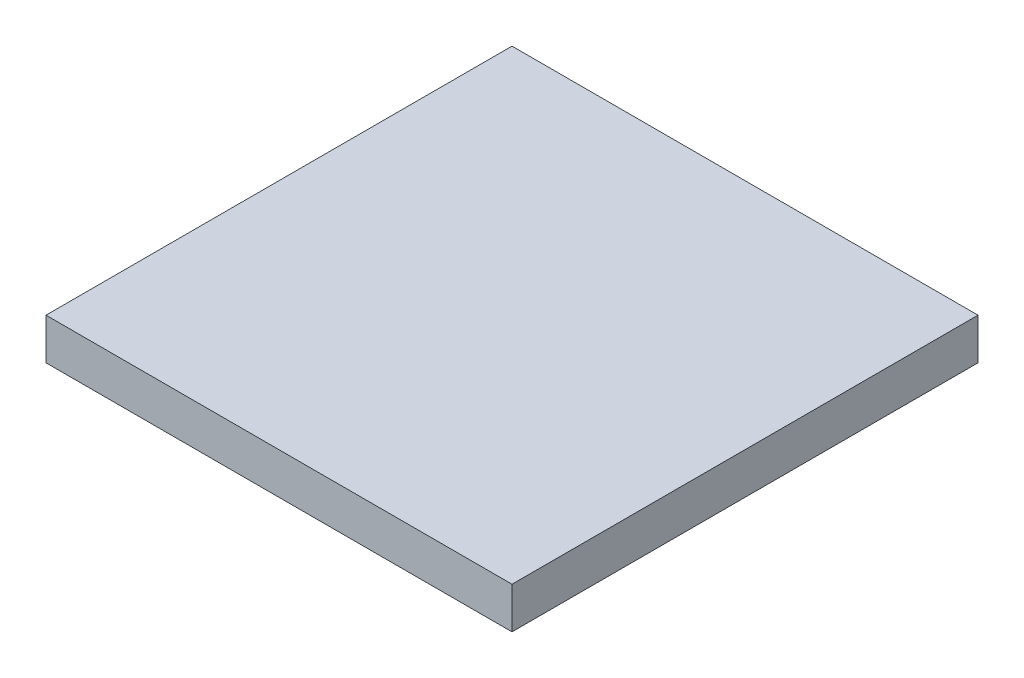
ISO-10303-21;
HEADER;
FILE_DESCRIPTION(('STEP AP214'),'2;1');
FILE_NAME('part.step','',(''),(''),'','','');
FILE_SCHEMA(('AUTOMOTIVE_DESIGN { 1 0 10303 214 1 1 1 1 }'));
ENDSEC;
DATA;
#1=APPLICATION_CONTEXT('core data for automotive mechanical design processes');
#2=APPLICATION_PROTOCOL_DEFINITION('international standard','automotive_design',2000,#1);
#3=PRODUCT_CONTEXT('',#1,'mechanical');
#4=PRODUCT('Part','Part','',(#3));
#5=PRODUCT_RELATED_PRODUCT_CATEGORY('part','',(#4));
#6=PRODUCT_DEFINITION_FORMATION('','',#4);
#7=PRODUCT_DEFINITION_CONTEXT('part definition',#1,'design');
#8=PRODUCT_DEFINITION('design','',#6,#7);
#9=PRODUCT_DEFINITION_SHAPE('','',#8);
#10=(LENGTH_UNIT() NAMED_UNIT(*) SI_UNIT(.MILLI.,.METRE.));
#11=(NAMED_UNIT(*) PLANE_ANGLE_UNIT() SI_UNIT($,.RADIAN.));
#12=(NAMED_UNIT(*) SI_UNIT($,.STERADIAN.) SOLID_ANGLE_UNIT());
#13=UNCERTAINTY_MEASURE_WITH_UNIT(LENGTH_MEASURE(1.E-05),#10,'distance_accuracy_value','');
#14=(GEOMETRIC_REPRESENTATION_CONTEXT(3) GLOBAL_UNCERTAINTY_ASSIGNED_CONTEXT((#13)) GLOBAL_UNIT_ASSIGNED_CONTEXT((#10,
#11,#12)) REPRESENTATION_CONTEXT('',''));
#15=CARTESIAN_POINT('',(0.,0.,0.));
#16=DIRECTION('',(0.,0.,1.));
#17=DIRECTION('',(1.,0.,0.));
#18=AXIS2_PLACEMENT_3D('',#15,#16,#17);
#19=CARTESIAN_POINT('',(-3.3274,2.9756,4.953));
#20=DIRECTION('',(1.,0.,0.));
#21=DIRECTION('',(0.,-1.,0.));
#22=AXIS2_PLACEMENT_3D('',#19,#20,#21);
#23=PLANE('',#22);
#24=DIRECTION('',(0.,0.,1.));
#25=VECTOR('',#24,1.);
#26=CARTESIAN_POINT('',(-3.3274,2.9306,4.953));
#27=LINE('',#26,#25);
#28=CARTESIAN_POINT('',(-3.3274,2.9306,4.4449999999999));
#29=VERTEX_POINT('',#28);
#30=CARTESIAN_POINT('',(-3.3274,2.9306,4.953));
#31=VERTEX_POINT('',#30);
#32=EDGE_CURVE('E11',#29,#31,#27,.T.);
#33=ORIENTED_EDGE('',*,*,#32,.T.);
#34=DIRECTION('',(0.,-1.,0.));
#35=VECTOR('',#34,1.);
#36=CARTESIAN_POINT('',(-3.3274,2.9756,4.953));
#37=LINE('',#36,#35);
#38=CARTESIAN_POINT('',(-3.3274,2.9756,4.953));
#39=VERTEX_POINT('',#38);
#40=EDGE_CURVE('E24',#39,#31,#37,.T.);
#41=ORIENTED_EDGE('',*,*,#40,.F.);
#42=DIRECTION('',(0.,0.,1.));
#43=VECTOR('',#42,1.);
#44=CARTESIAN_POINT('',(-3.3274,2.9756,4.953));
#45=LINE('',#44,#43);
#46=CARTESIAN_POINT('',(-3.3274,2.9756,4.4449999999999));
#47=VERTEX_POINT('',#46);
#48=EDGE_CURVE('E88',#47,#39,#45,.T.);
#49=ORIENTED_EDGE('',*,*,#48,.F.);
#50=DIRECTION('',(0.,-1.,0.));
#51=VECTOR('',#50,1.);
#52=CARTESIAN_POINT('',(-3.3274,2.9756,4.4449999999999));
#53=LINE('',#52,#51);
#54=EDGE_CURVE('E77',#47,#29,#53,.T.);
#55=ORIENTED_EDGE('',*,*,#54,.T.);
#56=EDGE_LOOP('',(#33,#41,#49,#55));
#57=FACE_BOUND('',#56,.T.);
#58=ADVANCED_FACE('F17',(#57),#23,.F.);
#59=CARTESIAN_POINT('',(-2.8194,2.9756,4.953));
#60=DIRECTION('',(0.,0.,-1.));
#61=DIRECTION('',(0.,1.,0.));
#62=AXIS2_PLACEMENT_3D('',#59,#60,#61);
#63=PLANE('',#62);
#64=DIRECTION('',(1.,0.,0.));
#65=VECTOR('',#64,1.);
#66=CARTESIAN_POINT('',(-2.8194,2.9306,4.953));
#67=LINE('',#66,#65);
#68=CARTESIAN_POINT('',(-2.8194,2.9306,4.953));
#69=VERTEX_POINT('',#68);
#70=EDGE_CURVE('E85',#31,#69,#67,.T.);
#71=ORIENTED_EDGE('',*,*,#70,.T.);
#72=DIRECTION('',(0.,-1.,0.));
#73=VECTOR('',#72,1.);
#74=CARTESIAN_POINT('',(-2.8194,2.9756,4.953));
#75=LINE('',#74,#73);
#76=CARTESIAN_POINT('',(-2.8194,2.9756,4.953));
#77=VERTEX_POINT('',#76);
#78=EDGE_CURVE('E83',#77,#69,#75,.T.);
#79=ORIENTED_EDGE('',*,*,#78,.F.);
#80=DIRECTION('',(1.,0.,0.));
#81=VECTOR('',#80,1.);
#82=CARTESIAN_POINT('',(-2.8194,2.9756,4.953));
#83=LINE('',#82,#81);
#84=EDGE_CURVE('E72',#39,#77,#83,.T.);
#85=ORIENTED_EDGE('',*,*,#84,.F.);
#86=ORIENTED_EDGE('',*,*,#40,.T.);
#87=EDGE_LOOP('',(#71,#79,#85,#86));
#88=FACE_BOUND('',#87,.T.);
#89=ADVANCED_FACE('F90',(#88),#63,.F.);
#90=CARTESIAN_POINT('',(-2.8194,2.9756,4.4449999999999));
#91=DIRECTION('',(-1.,0.,0.));
#92=DIRECTION('',(0.,1.,0.));
#93=AXIS2_PLACEMENT_3D('',#90,#91,#92);
#94=PLANE('',#93);
#95=DIRECTION('',(0.,0.,-1.));
#96=VECTOR('',#95,1.);
#97=CARTESIAN_POINT('',(-2.8194,2.9306,4.4449999999999));
#98=LINE('',#97,#96);
#99=CARTESIAN_POINT('',(-2.8194,2.9306,4.4449999999999));
#100=VERTEX_POINT('',#99);
#101=EDGE_CURVE('E60',#69,#100,#98,.T.);
#102=ORIENTED_EDGE('',*,*,#101,.T.);
#103=DIRECTION('',(0.,-1.,0.));
#104=VECTOR('',#103,1.);
#105=CARTESIAN_POINT('',(-2.8194,2.9756,4.4449999999999));
#106=LINE('',#105,#104);
#107=CARTESIAN_POINT('',(-2.8194,2.9756,4.4449999999999));
#108=VERTEX_POINT('',#107);
#109=EDGE_CURVE('E54',#108,#100,#106,.T.);
#110=ORIENTED_EDGE('',*,*,#109,.F.);
#111=DIRECTION('',(0.,0.,-1.));
#112=VECTOR('',#111,1.);
#113=CARTESIAN_POINT('',(-2.8194,2.9756,4.4449999999999));
#114=LINE('',#113,#112);
#115=EDGE_CURVE('E58',#77,#108,#114,.T.);
#116=ORIENTED_EDGE('',*,*,#115,.F.);
#117=ORIENTED_EDGE('',*,*,#78,.T.);
#118=EDGE_LOOP('',(#102,#110,#116,#117));
#119=FACE_BOUND('',#118,.T.);
#120=ADVANCED_FACE('F56',(#119),#94,.F.);
#121=CARTESIAN_POINT('',(-3.3274,2.9756,4.4449999999999));
#122=DIRECTION('',(0.,0.,1.));
#123=DIRECTION('',(0.,-1.,0.));
#124=AXIS2_PLACEMENT_3D('',#121,#122,#123);
#125=PLANE('',#124);
#126=DIRECTION('',(-1.,0.,0.));
#127=VECTOR('',#126,1.);
#128=CARTESIAN_POINT('',(-3.3274,2.9306,4.4449999999999));
#129=LINE('',#128,#127);
#130=EDGE_CURVE('E73',#100,#29,#129,.T.);
#131=ORIENTED_EDGE('',*,*,#130,.T.);
#132=ORIENTED_EDGE('',*,*,#54,.F.);
#133=DIRECTION('',(-1.,0.,0.));
#134=VECTOR('',#133,1.);
#135=CARTESIAN_POINT('',(-3.3274,2.9756,4.4449999999999));
#136=LINE('',#135,#134);
#137=EDGE_CURVE('E70',#108,#47,#136,.T.);
#138=ORIENTED_EDGE('',*,*,#137,.F.);
#139=ORIENTED_EDGE('',*,*,#109,.T.);
#140=EDGE_LOOP('',(#131,#132,#138,#139));
#141=FACE_BOUND('',#140,.T.);
#142=ADVANCED_FACE('F76',(#141),#125,.F.);
#143=CARTESIAN_POINT('',(0.,2.9756,0.));
#144=DIRECTION('',(0.,-1.,0.));
#145=DIRECTION('',(-1.,0.,0.));
#146=AXIS2_PLACEMENT_3D('',#143,#144,#145);
#147=PLANE('',#146);
#148=ORIENTED_EDGE('',*,*,#48,.T.);
#149=ORIENTED_EDGE('',*,*,#84,.T.);
#150=ORIENTED_EDGE('',*,*,#115,.T.);
#151=ORIENTED_EDGE('',*,*,#137,.T.);
#152=EDGE_LOOP('',(#148,#149,#150,#151));
#153=FACE_BOUND('',#152,.T.);
#154=ADVANCED_FACE('F69',(#153),#147,.F.);
#155=CARTESIAN_POINT('',(0.,2.9306,0.));
#156=DIRECTION('',(0.,-1.,0.));
#157=DIRECTION('',(-1.,0.,0.));
#158=AXIS2_PLACEMENT_3D('',#155,#156,#157);
#159=PLANE('',#158);
#160=ORIENTED_EDGE('',*,*,#32,.F.);
#161=ORIENTED_EDGE('',*,*,#130,.F.);
#162=ORIENTED_EDGE('',*,*,#101,.F.);
#163=ORIENTED_EDGE('',*,*,#70,.F.);
#164=EDGE_LOOP('',(#160,#161,#162,#163));
#165=FACE_BOUND('',#164,.T.);
#166=ADVANCED_FACE('F91',(#165),#159,.T.);
#167=CLOSED_SHELL('',(#58,#89,#120,#142,#154,#166));
#168=MANIFOLD_SOLID_BREP('B1',#167);
#169=ADVANCED_BREP_SHAPE_REPRESENTATION('',(#18,#168),#14);
#170=SHAPE_DEFINITION_REPRESENTATION(#9,#169);
ENDSEC;
END-ISO-10303-21;
